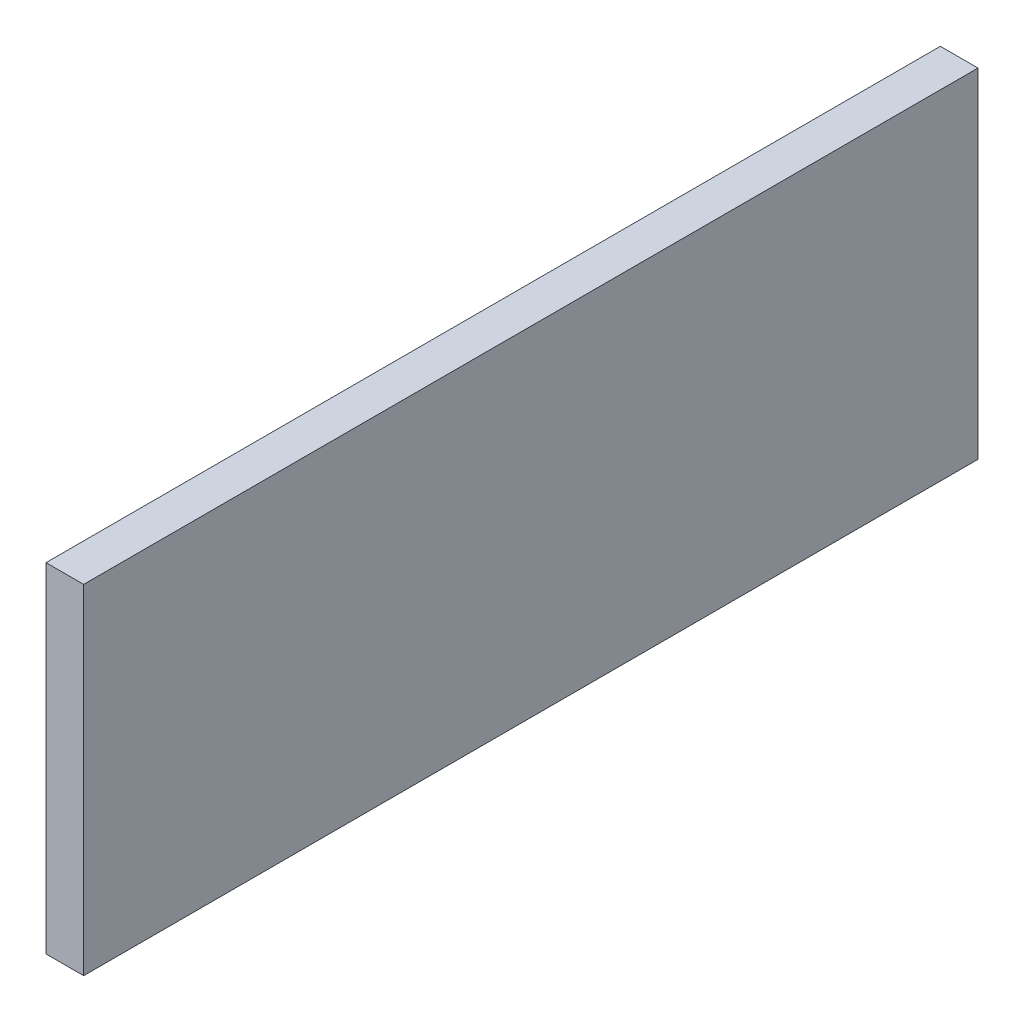
ISO-10303-21;
HEADER;
FILE_DESCRIPTION(('STEP AP214'),'2;1');
FILE_NAME('part.step','',(''),(''),'','','');
FILE_SCHEMA(('AUTOMOTIVE_DESIGN { 1 0 10303 214 1 1 1 1 }'));
ENDSEC;
DATA;
#1=APPLICATION_CONTEXT('core data for automotive mechanical design processes');
#2=APPLICATION_PROTOCOL_DEFINITION('international standard','automotive_design',2000,#1);
#3=PRODUCT_CONTEXT('',#1,'mechanical');
#4=PRODUCT('Part','Part','',(#3));
#5=PRODUCT_RELATED_PRODUCT_CATEGORY('part','',(#4));
#6=PRODUCT_DEFINITION_FORMATION('','',#4);
#7=PRODUCT_DEFINITION_CONTEXT('part definition',#1,'design');
#8=PRODUCT_DEFINITION('design','',#6,#7);
#9=PRODUCT_DEFINITION_SHAPE('','',#8);
#10=(LENGTH_UNIT() NAMED_UNIT(*) SI_UNIT(.MILLI.,.METRE.));
#11=(NAMED_UNIT(*) PLANE_ANGLE_UNIT() SI_UNIT($,.RADIAN.));
#12=(NAMED_UNIT(*) SI_UNIT($,.STERADIAN.) SOLID_ANGLE_UNIT());
#13=UNCERTAINTY_MEASURE_WITH_UNIT(LENGTH_MEASURE(1.E-05),#10,'distance_accuracy_value','');
#14=(GEOMETRIC_REPRESENTATION_CONTEXT(3) GLOBAL_UNCERTAINTY_ASSIGNED_CONTEXT((#13)) GLOBAL_UNIT_ASSIGNED_CONTEXT((#10,
#11,#12)) REPRESENTATION_CONTEXT('',''));
#15=CARTESIAN_POINT('',(0.,0.,0.));
#16=DIRECTION('',(0.,0.,1.));
#17=DIRECTION('',(1.,0.,0.));
#18=AXIS2_PLACEMENT_3D('',#15,#16,#17);
#19=CARTESIAN_POINT('',(12.,20.25,-1.25));
#20=DIRECTION('',(0.,0.,-1.));
#21=DIRECTION('',(-1.,0.,0.));
#22=AXIS2_PLACEMENT_3D('',#19,#20,#21);
#23=PLANE('',#22);
#24=DIRECTION('',(0.,-1.,0.));
#25=VECTOR('',#24,1.);
#26=CARTESIAN_POINT('',(10.,20.25,-1.25));
#27=LINE('',#26,#25);
#28=CARTESIAN_POINT('',(10.,20.25,-1.25));
#29=VERTEX_POINT('',#28);
#30=CARTESIAN_POINT('',(10.,2.25,-1.25));
#31=VERTEX_POINT('',#30);
#32=EDGE_CURVE('E104',#29,#31,#27,.T.);
#33=ORIENTED_EDGE('',*,*,#32,.T.);
#34=DIRECTION('',(-1.,0.,0.));
#35=VECTOR('',#34,1.);
#36=CARTESIAN_POINT('',(12.,2.25,-1.25));
#37=LINE('',#36,#35);
#38=CARTESIAN_POINT('',(12.,2.25,-1.25));
#39=VERTEX_POINT('',#38);
#40=EDGE_CURVE('E11',#39,#31,#37,.T.);
#41=ORIENTED_EDGE('',*,*,#40,.F.);
#42=DIRECTION('',(0.,-1.,0.));
#43=VECTOR('',#42,1.);
#44=CARTESIAN_POINT('',(12.,20.25,-1.25));
#45=LINE('',#44,#43);
#46=CARTESIAN_POINT('',(12.,20.25,-1.25));
#47=VERTEX_POINT('',#46);
#48=EDGE_CURVE('E92',#47,#39,#45,.T.);
#49=ORIENTED_EDGE('',*,*,#48,.F.);
#50=DIRECTION('',(-1.,0.,0.));
#51=VECTOR('',#50,1.);
#52=CARTESIAN_POINT('',(12.,20.25,-1.25));
#53=LINE('',#52,#51);
#54=EDGE_CURVE('E100',#47,#29,#53,.T.);
#55=ORIENTED_EDGE('',*,*,#54,.T.);
#56=EDGE_LOOP('',(#33,#41,#49,#55));
#57=FACE_BOUND('',#56,.T.);
#58=ADVANCED_FACE('F41',(#57),#23,.F.);
#59=CARTESIAN_POINT('',(12.,2.25,-1.25));
#60=DIRECTION('',(0.,1.,0.));
#61=DIRECTION('',(0.,0.,1.));
#62=AXIS2_PLACEMENT_3D('',#59,#60,#61);
#63=PLANE('',#62);
#64=DIRECTION('',(0.,0.,-1.));
#65=VECTOR('',#64,1.);
#66=CARTESIAN_POINT('',(10.,2.25,-1.25));
#67=LINE('',#66,#65);
#68=CARTESIAN_POINT('',(10.,2.25,-48.75));
#69=VERTEX_POINT('',#68);
#70=EDGE_CURVE('E96',#31,#69,#67,.T.);
#71=ORIENTED_EDGE('',*,*,#70,.T.);
#72=DIRECTION('',(-1.,0.,0.));
#73=VECTOR('',#72,1.);
#74=CARTESIAN_POINT('',(12.,2.25,-48.75));
#75=LINE('',#74,#73);
#76=CARTESIAN_POINT('',(12.,2.25,-48.75));
#77=VERTEX_POINT('',#76);
#78=EDGE_CURVE('E49',#77,#69,#75,.T.);
#79=ORIENTED_EDGE('',*,*,#78,.F.);
#80=DIRECTION('',(0.,0.,-1.));
#81=VECTOR('',#80,1.);
#82=CARTESIAN_POINT('',(12.,2.25,-1.25));
#83=LINE('',#82,#81);
#84=EDGE_CURVE('E87',#39,#77,#83,.T.);
#85=ORIENTED_EDGE('',*,*,#84,.F.);
#86=ORIENTED_EDGE('',*,*,#40,.T.);
#87=EDGE_LOOP('',(#71,#79,#85,#86));
#88=FACE_BOUND('',#87,.T.);
#89=ADVANCED_FACE('F95',(#88),#63,.F.);
#90=CARTESIAN_POINT('',(12.,20.25,-48.75));
#91=DIRECTION('',(0.,0.,1.));
#92=DIRECTION('',(1.,0.,0.));
#93=AXIS2_PLACEMENT_3D('',#90,#91,#92);
#94=PLANE('',#93);
#95=DIRECTION('',(0.,1.,0.));
#96=VECTOR('',#95,1.);
#97=CARTESIAN_POINT('',(10.,20.25,-48.75));
#98=LINE('',#97,#96);
#99=CARTESIAN_POINT('',(10.,20.25,-48.75));
#100=VERTEX_POINT('',#99);
#101=EDGE_CURVE('E74',#69,#100,#98,.T.);
#102=ORIENTED_EDGE('',*,*,#101,.T.);
#103=DIRECTION('',(-1.,0.,0.));
#104=VECTOR('',#103,1.);
#105=CARTESIAN_POINT('',(12.,20.25,-48.75));
#106=LINE('',#105,#104);
#107=CARTESIAN_POINT('',(12.,20.25,-48.75));
#108=VERTEX_POINT('',#107);
#109=EDGE_CURVE('E97',#108,#100,#106,.T.);
#110=ORIENTED_EDGE('',*,*,#109,.F.);
#111=DIRECTION('',(0.,1.,0.));
#112=VECTOR('',#111,1.);
#113=CARTESIAN_POINT('',(12.,20.25,-48.75));
#114=LINE('',#113,#112);
#115=EDGE_CURVE('E90',#77,#108,#114,.T.);
#116=ORIENTED_EDGE('',*,*,#115,.F.);
#117=ORIENTED_EDGE('',*,*,#78,.T.);
#118=EDGE_LOOP('',(#102,#110,#116,#117));
#119=FACE_BOUND('',#118,.T.);
#120=ADVANCED_FACE('F98',(#119),#94,.F.);
#121=CARTESIAN_POINT('',(12.,20.25,-1.25));
#122=DIRECTION('',(0.,-1.,0.));
#123=DIRECTION('',(0.,0.,-1.));
#124=AXIS2_PLACEMENT_3D('',#121,#122,#123);
#125=PLANE('',#124);
#126=DIRECTION('',(0.,0.,1.));
#127=VECTOR('',#126,1.);
#128=CARTESIAN_POINT('',(10.,20.25,-1.25));
#129=LINE('',#128,#127);
#130=EDGE_CURVE('E80',#100,#29,#129,.T.);
#131=ORIENTED_EDGE('',*,*,#130,.T.);
#132=ORIENTED_EDGE('',*,*,#54,.F.);
#133=DIRECTION('',(0.,0.,1.));
#134=VECTOR('',#133,1.);
#135=CARTESIAN_POINT('',(12.,20.25,-1.25));
#136=LINE('',#135,#134);
#137=EDGE_CURVE('E57',#108,#47,#136,.T.);
#138=ORIENTED_EDGE('',*,*,#137,.F.);
#139=ORIENTED_EDGE('',*,*,#109,.T.);
#140=EDGE_LOOP('',(#131,#132,#138,#139));
#141=FACE_BOUND('',#140,.T.);
#142=ADVANCED_FACE('F111',(#141),#125,.F.);
#143=CARTESIAN_POINT('',(12.,0.,0.));
#144=DIRECTION('',(1.,0.,0.));
#145=DIRECTION('',(0.,0.,-1.));
#146=AXIS2_PLACEMENT_3D('',#143,#144,#145);
#147=PLANE('',#146);
#148=ORIENTED_EDGE('',*,*,#48,.T.);
#149=ORIENTED_EDGE('',*,*,#84,.T.);
#150=ORIENTED_EDGE('',*,*,#115,.T.);
#151=ORIENTED_EDGE('',*,*,#137,.T.);
#152=EDGE_LOOP('',(#148,#149,#150,#151));
#153=FACE_BOUND('',#152,.T.);
#154=ADVANCED_FACE('F88',(#153),#147,.T.);
#155=CARTESIAN_POINT('',(10.,0.,0.));
#156=DIRECTION('',(1.,0.,0.));
#157=DIRECTION('',(0.,0.,-1.));
#158=AXIS2_PLACEMENT_3D('',#155,#156,#157);
#159=PLANE('',#158);
#160=ORIENTED_EDGE('',*,*,#32,.F.);
#161=ORIENTED_EDGE('',*,*,#130,.F.);
#162=ORIENTED_EDGE('',*,*,#101,.F.);
#163=ORIENTED_EDGE('',*,*,#70,.F.);
#164=EDGE_LOOP('',(#160,#161,#162,#163));
#165=FACE_BOUND('',#164,.T.);
#166=ADVANCED_FACE('F114',(#165),#159,.F.);
#167=CLOSED_SHELL('',(#58,#89,#120,#142,#154,#166));
#168=MANIFOLD_SOLID_BREP('B2',#167);
#169=ADVANCED_BREP_SHAPE_REPRESENTATION('',(#18,#168),#14);
#170=SHAPE_DEFINITION_REPRESENTATION(#9,#169);
ENDSEC;
END-ISO-10303-21;
